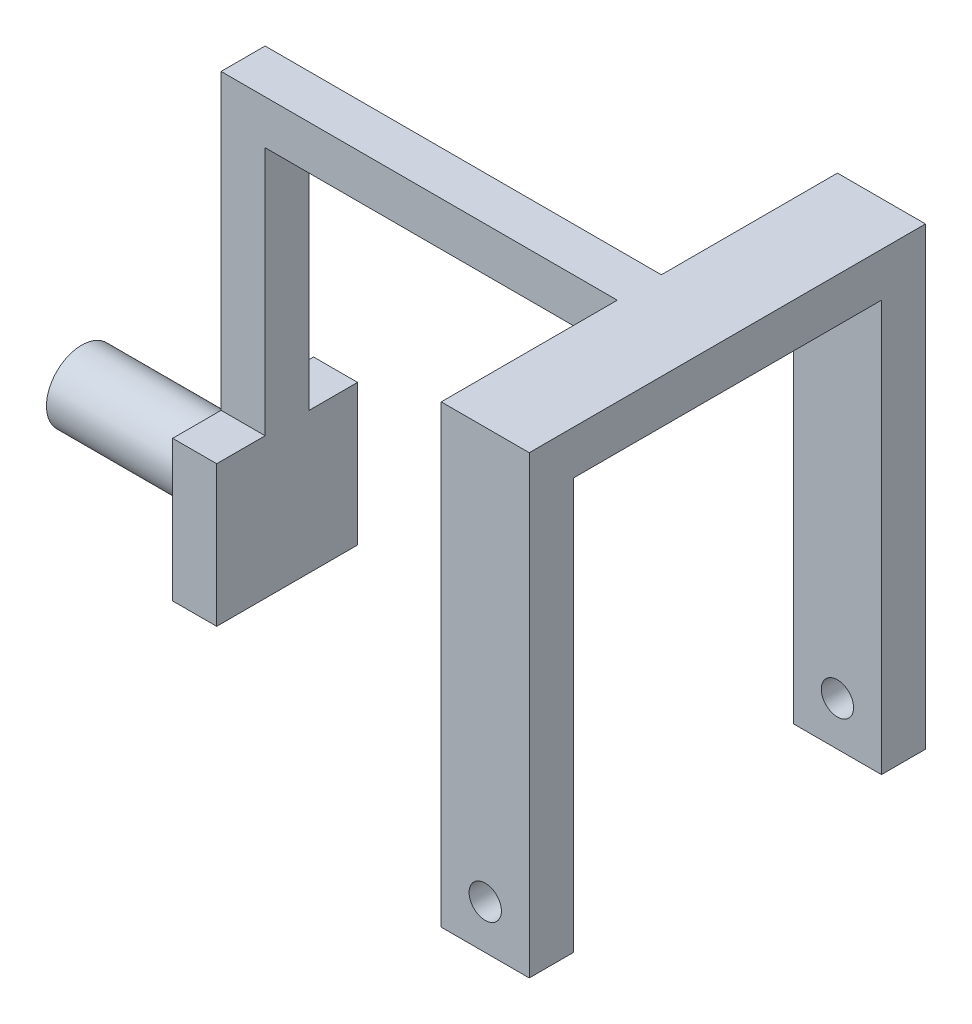
ISO-10303-21;
HEADER;
FILE_DESCRIPTION(('STEP AP214'),'2;1');
FILE_NAME('part.step','',(''),(''),'','','');
FILE_SCHEMA(('AUTOMOTIVE_DESIGN { 1 0 10303 214 1 1 1 1 }'));
ENDSEC;
DATA;
#1=APPLICATION_CONTEXT('core data for automotive mechanical design processes');
#2=APPLICATION_PROTOCOL_DEFINITION('international standard','automotive_design',2000,#1);
#3=PRODUCT_CONTEXT('',#1,'mechanical');
#4=PRODUCT('Part','Part','',(#3));
#5=PRODUCT_RELATED_PRODUCT_CATEGORY('part','',(#4));
#6=PRODUCT_DEFINITION_FORMATION('','',#4);
#7=PRODUCT_DEFINITION_CONTEXT('part definition',#1,'design');
#8=PRODUCT_DEFINITION('design','',#6,#7);
#9=PRODUCT_DEFINITION_SHAPE('','',#8);
#10=(LENGTH_UNIT() NAMED_UNIT(*) SI_UNIT(.MILLI.,.METRE.));
#11=(NAMED_UNIT(*) PLANE_ANGLE_UNIT() SI_UNIT($,.RADIAN.));
#12=(NAMED_UNIT(*) SI_UNIT($,.STERADIAN.) SOLID_ANGLE_UNIT());
#13=UNCERTAINTY_MEASURE_WITH_UNIT(LENGTH_MEASURE(1.E-05),#10,'distance_accuracy_value','');
#14=(GEOMETRIC_REPRESENTATION_CONTEXT(3) GLOBAL_UNCERTAINTY_ASSIGNED_CONTEXT((#13)) GLOBAL_UNIT_ASSIGNED_CONTEXT((#10,
#11,#12)) REPRESENTATION_CONTEXT('',''));
#15=CARTESIAN_POINT('',(0.,0.,0.));
#16=DIRECTION('',(0.,0.,1.));
#17=DIRECTION('',(1.,0.,0.));
#18=AXIS2_PLACEMENT_3D('',#15,#16,#17);
#19=CARTESIAN_POINT('',(220.,109.,7.5));
#20=DIRECTION('',(0.,1.,0.));
#21=DIRECTION('',(0.,0.,1.));
#22=AXIS2_PLACEMENT_3D('',#19,#20,#21);
#23=PLANE('',#22);
#24=DIRECTION('',(-1.,0.,0.));
#25=VECTOR('',#24,1.);
#26=CARTESIAN_POINT('',(190.,109.,-52.5));
#27=LINE('',#26,#25);
#28=CARTESIAN_POINT('',(220.,109.,-52.5));
#29=VERTEX_POINT('',#28);
#30=CARTESIAN_POINT('',(190.,109.,-52.5));
#31=VERTEX_POINT('',#30);
#32=EDGE_CURVE('E197',#29,#31,#27,.T.);
#33=ORIENTED_EDGE('',*,*,#32,.F.);
#34=DIRECTION('',(0.,0.,-1.));
#35=VECTOR('',#34,1.);
#36=CARTESIAN_POINT('',(220.,109.,7.5));
#37=LINE('',#36,#35);
#38=CARTESIAN_POINT('',(220.,109.,52.5));
#39=VERTEX_POINT('',#38);
#40=EDGE_CURVE('E66',#39,#29,#37,.T.);
#41=ORIENTED_EDGE('',*,*,#40,.F.);
#42=DIRECTION('',(1.,0.,0.));
#43=VECTOR('',#42,1.);
#44=CARTESIAN_POINT('',(190.,109.,52.5));
#45=LINE('',#44,#43);
#46=CARTESIAN_POINT('',(190.,109.,52.5));
#47=VERTEX_POINT('',#46);
#48=EDGE_CURVE('E216',#47,#39,#45,.T.);
#49=ORIENTED_EDGE('',*,*,#48,.F.);
#50=DIRECTION('',(0.,0.,-1.));
#51=VECTOR('',#50,1.);
#52=CARTESIAN_POINT('',(190.,109.,67.5));
#53=LINE('',#52,#51);
#54=CARTESIAN_POINT('',(190.,109.,7.50000000000001));
#55=VERTEX_POINT('',#54);
#56=EDGE_CURVE('E239',#47,#55,#53,.T.);
#57=ORIENTED_EDGE('',*,*,#56,.T.);
#58=DIRECTION('',(-1.,0.,0.));
#59=VECTOR('',#58,1.);
#60=CARTESIAN_POINT('',(220.,109.,7.5));
#61=LINE('',#60,#59);
#62=CARTESIAN_POINT('',(70.,109.,7.5));
#63=VERTEX_POINT('',#62);
#64=EDGE_CURVE('E258',#55,#63,#61,.T.);
#65=ORIENTED_EDGE('',*,*,#64,.T.);
#66=DIRECTION('',(0.,0.,-1.));
#67=VECTOR('',#66,1.);
#68=CARTESIAN_POINT('',(70.,109.,7.5));
#69=LINE('',#68,#67);
#70=CARTESIAN_POINT('',(70.,109.,-7.5));
#71=VERTEX_POINT('',#70);
#72=EDGE_CURVE('E250',#63,#71,#69,.T.);
#73=ORIENTED_EDGE('',*,*,#72,.T.);
#74=DIRECTION('',(-1.,0.,0.));
#75=VECTOR('',#74,1.);
#76=CARTESIAN_POINT('',(220.,109.,-7.5));
#77=LINE('',#76,#75);
#78=CARTESIAN_POINT('',(190.,109.,-7.50000000000001));
#79=VERTEX_POINT('',#78);
#80=EDGE_CURVE('E254',#79,#71,#77,.T.);
#81=ORIENTED_EDGE('',*,*,#80,.F.);
#82=EDGE_CURVE('E242',#79,#31,#53,.T.);
#83=ORIENTED_EDGE('',*,*,#82,.T.);
#84=EDGE_LOOP('',(#33,#41,#49,#57,#65,#73,#81,#83));
#85=FACE_BOUND('',#84,.T.);
#86=ADVANCED_FACE('F49',(#85),#23,.F.);
#87=CARTESIAN_POINT('',(70.,0.,0.));
#88=DIRECTION('',(-1.,0.,0.));
#89=DIRECTION('',(0.,0.,1.));
#90=AXIS2_PLACEMENT_3D('',#87,#88,#89);
#91=PLANE('',#90);
#92=ORIENTED_EDGE('',*,*,#72,.F.);
#93=DIRECTION('',(0.,-1.,0.));
#94=VECTOR('',#93,1.);
#95=CARTESIAN_POINT('',(70.,124.,7.5));
#96=LINE('',#95,#94);
#97=CARTESIAN_POINT('',(70.,24.,7.5));
#98=VERTEX_POINT('',#97);
#99=EDGE_CURVE('E269',#63,#98,#96,.T.);
#100=ORIENTED_EDGE('',*,*,#99,.T.);
#101=DIRECTION('',(0.,0.,1.));
#102=VECTOR('',#101,1.);
#103=CARTESIAN_POINT('',(70.,24.,24.));
#104=LINE('',#103,#102);
#105=CARTESIAN_POINT('',(70.,24.,24.));
#106=VERTEX_POINT('',#105);
#107=EDGE_CURVE('E287',#98,#106,#104,.T.);
#108=ORIENTED_EDGE('',*,*,#107,.T.);
#109=DIRECTION('',(0.,-1.,0.));
#110=VECTOR('',#109,1.);
#111=CARTESIAN_POINT('',(70.,-24.,24.));
#112=LINE('',#111,#110);
#113=CARTESIAN_POINT('',(70.,-24.,24.));
#114=VERTEX_POINT('',#113);
#115=EDGE_CURVE('E292',#106,#114,#112,.T.);
#116=ORIENTED_EDGE('',*,*,#115,.T.);
#117=DIRECTION('',(0.,0.,-1.));
#118=VECTOR('',#117,1.);
#119=CARTESIAN_POINT('',(70.,-24.,24.));
#120=LINE('',#119,#118);
#121=CARTESIAN_POINT('',(70.,-24.,-24.));
#122=VERTEX_POINT('',#121);
#123=EDGE_CURVE('E294',#114,#122,#120,.T.);
#124=ORIENTED_EDGE('',*,*,#123,.T.);
#125=DIRECTION('',(0.,1.,0.));
#126=VECTOR('',#125,1.);
#127=CARTESIAN_POINT('',(70.,-24.,-24.));
#128=LINE('',#127,#126);
#129=CARTESIAN_POINT('',(70.,24.,-24.));
#130=VERTEX_POINT('',#129);
#131=EDGE_CURVE('E284',#122,#130,#128,.T.);
#132=ORIENTED_EDGE('',*,*,#131,.T.);
#133=CARTESIAN_POINT('',(70.,24.,-7.5));
#134=VERTEX_POINT('',#133);
#135=EDGE_CURVE('E289',#130,#134,#104,.T.);
#136=ORIENTED_EDGE('',*,*,#135,.T.);
#137=DIRECTION('',(0.,-1.,0.));
#138=VECTOR('',#137,1.);
#139=CARTESIAN_POINT('',(70.,124.,-7.5));
#140=LINE('',#139,#138);
#141=EDGE_CURVE('E281',#71,#134,#140,.T.);
#142=ORIENTED_EDGE('',*,*,#141,.F.);
#143=EDGE_LOOP('',(#92,#100,#108,#116,#124,#132,#136,#142));
#144=FACE_BOUND('',#143,.T.);
#145=ADVANCED_FACE('F332',(#144),#91,.F.);
#146=CARTESIAN_POINT('',(70.,24.,24.));
#147=DIRECTION('',(0.,-1.,0.));
#148=DIRECTION('',(0.,0.,-1.));
#149=AXIS2_PLACEMENT_3D('',#146,#147,#148);
#150=PLANE('',#149);
#151=DIRECTION('',(1.,0.,0.));
#152=VECTOR('',#151,1.);
#153=CARTESIAN_POINT('',(55.,24.,7.5));
#154=LINE('',#153,#152);
#155=CARTESIAN_POINT('',(55.,24.,7.5));
#156=VERTEX_POINT('',#155);
#157=EDGE_CURVE('E264',#156,#98,#154,.T.);
#158=ORIENTED_EDGE('',*,*,#157,.F.);
#159=DIRECTION('',(0.,0.,1.));
#160=VECTOR('',#159,1.);
#161=CARTESIAN_POINT('',(55.,24.,24.));
#162=LINE('',#161,#160);
#163=CARTESIAN_POINT('',(55.,24.,24.));
#164=VERTEX_POINT('',#163);
#165=EDGE_CURVE('E299',#156,#164,#162,.T.);
#166=ORIENTED_EDGE('',*,*,#165,.T.);
#167=DIRECTION('',(-1.,0.,0.));
#168=VECTOR('',#167,1.);
#169=CARTESIAN_POINT('',(70.,24.,24.));
#170=LINE('',#169,#168);
#171=EDGE_CURVE('E310',#106,#164,#170,.T.);
#172=ORIENTED_EDGE('',*,*,#171,.F.);
#173=ORIENTED_EDGE('',*,*,#107,.F.);
#174=EDGE_LOOP('',(#158,#166,#172,#173));
#175=FACE_BOUND('',#174,.T.);
#176=ADVANCED_FACE('F337',(#175),#150,.F.);
#177=DIRECTION('',(-1.,0.,0.));
#178=VECTOR('',#177,1.);
#179=CARTESIAN_POINT('',(55.,24.,-7.5));
#180=LINE('',#179,#178);
#181=CARTESIAN_POINT('',(55.,24.,-7.5));
#182=VERTEX_POINT('',#181);
#183=EDGE_CURVE('E260',#134,#182,#180,.T.);
#184=ORIENTED_EDGE('',*,*,#183,.F.);
#185=ORIENTED_EDGE('',*,*,#135,.F.);
#186=DIRECTION('',(-1.,0.,0.));
#187=VECTOR('',#186,1.);
#188=CARTESIAN_POINT('',(70.,24.,-24.));
#189=LINE('',#188,#187);
#190=CARTESIAN_POINT('',(55.,24.,-24.));
#191=VERTEX_POINT('',#190);
#192=EDGE_CURVE('E313',#130,#191,#189,.T.);
#193=ORIENTED_EDGE('',*,*,#192,.T.);
#194=EDGE_CURVE('E300',#191,#182,#162,.T.);
#195=ORIENTED_EDGE('',*,*,#194,.T.);
#196=EDGE_LOOP('',(#184,#185,#193,#195));
#197=FACE_BOUND('',#196,.T.);
#198=ADVANCED_FACE('F329',(#197),#150,.F.);
#199=CARTESIAN_POINT('',(55.,0.,0.));
#200=DIRECTION('',(-1.,0.,0.));
#201=DIRECTION('',(0.,0.,1.));
#202=AXIS2_PLACEMENT_3D('',#199,#200,#201);
#203=CYLINDRICAL_SURFACE('',#202,12.);
#204=CARTESIAN_POINT('',(55.,0.,0.));
#205=DIRECTION('',(1.,0.,0.));
#206=DIRECTION('',(0.,0.,-1.));
#207=AXIS2_PLACEMENT_3D('',#204,#205,#206);
#208=CIRCLE('',#207,12.);
#209=CARTESIAN_POINT('',(55.,0.,-12.));
#210=VERTEX_POINT('',#209);
#211=EDGE_CURVE('E11',#210,#210,#208,.T.);
#212=ORIENTED_EDGE('',*,*,#211,.F.);
#213=EDGE_LOOP('',(#212));
#214=FACE_BOUND('',#213,.T.);
#215=CARTESIAN_POINT('',(0.,0.,0.));
#216=DIRECTION('',(1.,0.,0.));
#217=DIRECTION('',(0.,0.,-1.));
#218=AXIS2_PLACEMENT_3D('',#215,#216,#217);
#219=CIRCLE('',#218,12.);
#220=CARTESIAN_POINT('',(0.,0.,-12.));
#221=VERTEX_POINT('',#220);
#222=EDGE_CURVE('E58',#221,#221,#219,.T.);
#223=ORIENTED_EDGE('',*,*,#222,.T.);
#224=EDGE_LOOP('',(#223));
#225=FACE_BOUND('',#224,.T.);
#226=ADVANCED_FACE('F51',(#214,#225),#203,.T.);
#227=CARTESIAN_POINT('',(0.,0.,0.));
#228=DIRECTION('',(1.,0.,0.));
#229=DIRECTION('',(0.,0.,-1.));
#230=AXIS2_PLACEMENT_3D('',#227,#228,#229);
#231=PLANE('',#230);
#232=ORIENTED_EDGE('',*,*,#222,.F.);
#233=EDGE_LOOP('',(#232));
#234=FACE_BOUND('',#233,.T.);
#235=ADVANCED_FACE('F319',(#234),#231,.F.);
#236=CARTESIAN_POINT('',(70.,-24.,-24.));
#237=DIRECTION('',(0.,0.,1.));
#238=DIRECTION('',(1.,0.,0.));
#239=AXIS2_PLACEMENT_3D('',#236,#237,#238);
#240=PLANE('',#239);
#241=DIRECTION('',(0.,1.,0.));
#242=VECTOR('',#241,1.);
#243=CARTESIAN_POINT('',(55.,-24.,-24.));
#244=LINE('',#243,#242);
#245=CARTESIAN_POINT('',(55.,-24.,-24.));
#246=VERTEX_POINT('',#245);
#247=EDGE_CURVE('E283',#246,#191,#244,.T.);
#248=ORIENTED_EDGE('',*,*,#247,.T.);
#249=ORIENTED_EDGE('',*,*,#192,.F.);
#250=ORIENTED_EDGE('',*,*,#131,.F.);
#251=DIRECTION('',(-1.,0.,0.));
#252=VECTOR('',#251,1.);
#253=CARTESIAN_POINT('',(70.,-24.,-24.));
#254=LINE('',#253,#252);
#255=EDGE_CURVE('E296',#122,#246,#254,.T.);
#256=ORIENTED_EDGE('',*,*,#255,.T.);
#257=EDGE_LOOP('',(#248,#249,#250,#256));
#258=FACE_BOUND('',#257,.T.);
#259=ADVANCED_FACE('F321',(#258),#240,.F.);
#260=CARTESIAN_POINT('',(70.,-24.,24.));
#261=DIRECTION('',(0.,0.,-1.));
#262=DIRECTION('',(-1.,0.,0.));
#263=AXIS2_PLACEMENT_3D('',#260,#261,#262);
#264=PLANE('',#263);
#265=DIRECTION('',(0.,-1.,0.));
#266=VECTOR('',#265,1.);
#267=CARTESIAN_POINT('',(55.,-24.,24.));
#268=LINE('',#267,#266);
#269=CARTESIAN_POINT('',(55.,-24.,24.));
#270=VERTEX_POINT('',#269);
#271=EDGE_CURVE('E302',#164,#270,#268,.T.);
#272=ORIENTED_EDGE('',*,*,#271,.T.);
#273=DIRECTION('',(-1.,0.,0.));
#274=VECTOR('',#273,1.);
#275=CARTESIAN_POINT('',(70.,-24.,24.));
#276=LINE('',#275,#274);
#277=EDGE_CURVE('E307',#114,#270,#276,.T.);
#278=ORIENTED_EDGE('',*,*,#277,.F.);
#279=ORIENTED_EDGE('',*,*,#115,.F.);
#280=ORIENTED_EDGE('',*,*,#171,.T.);
#281=EDGE_LOOP('',(#272,#278,#279,#280));
#282=FACE_BOUND('',#281,.T.);
#283=ADVANCED_FACE('F326',(#282),#264,.F.);
#284=CARTESIAN_POINT('',(70.,-24.,24.));
#285=DIRECTION('',(0.,1.,0.));
#286=DIRECTION('',(0.,0.,1.));
#287=AXIS2_PLACEMENT_3D('',#284,#285,#286);
#288=PLANE('',#287);
#289=DIRECTION('',(0.,0.,-1.));
#290=VECTOR('',#289,1.);
#291=CARTESIAN_POINT('',(55.,-24.,24.));
#292=LINE('',#291,#290);
#293=EDGE_CURVE('E288',#270,#246,#292,.T.);
#294=ORIENTED_EDGE('',*,*,#293,.T.);
#295=ORIENTED_EDGE('',*,*,#255,.F.);
#296=ORIENTED_EDGE('',*,*,#123,.F.);
#297=ORIENTED_EDGE('',*,*,#277,.T.);
#298=EDGE_LOOP('',(#294,#295,#296,#297));
#299=FACE_BOUND('',#298,.T.);
#300=ADVANCED_FACE('F357',(#299),#288,.F.);
#301=CARTESIAN_POINT('',(55.,0.,0.));
#302=DIRECTION('',(-1.,0.,0.));
#303=DIRECTION('',(0.,0.,1.));
#304=AXIS2_PLACEMENT_3D('',#301,#302,#303);
#305=PLANE('',#304);
#306=ORIENTED_EDGE('',*,*,#211,.T.);
#307=EDGE_LOOP('',(#306));
#308=FACE_BOUND('',#307,.T.);
#309=ORIENTED_EDGE('',*,*,#247,.F.);
#310=ORIENTED_EDGE('',*,*,#293,.F.);
#311=ORIENTED_EDGE('',*,*,#271,.F.);
#312=ORIENTED_EDGE('',*,*,#165,.F.);
#313=DIRECTION('',(0.,-1.,0.));
#314=VECTOR('',#313,1.);
#315=CARTESIAN_POINT('',(55.,124.,7.5));
#316=LINE('',#315,#314);
#317=CARTESIAN_POINT('',(55.,124.,7.5));
#318=VERTEX_POINT('',#317);
#319=EDGE_CURVE('E275',#318,#156,#316,.T.);
#320=ORIENTED_EDGE('',*,*,#319,.F.);
#321=DIRECTION('',(0.,0.,1.));
#322=VECTOR('',#321,1.);
#323=CARTESIAN_POINT('',(55.,124.,7.5));
#324=LINE('',#323,#322);
#325=CARTESIAN_POINT('',(55.,124.,-7.5));
#326=VERTEX_POINT('',#325);
#327=EDGE_CURVE('E263',#326,#318,#324,.T.);
#328=ORIENTED_EDGE('',*,*,#327,.F.);
#329=DIRECTION('',(0.,-1.,0.));
#330=VECTOR('',#329,1.);
#331=CARTESIAN_POINT('',(55.,124.,-7.5));
#332=LINE('',#331,#330);
#333=EDGE_CURVE('E278',#326,#182,#332,.T.);
#334=ORIENTED_EDGE('',*,*,#333,.T.);
#335=ORIENTED_EDGE('',*,*,#194,.F.);
#336=EDGE_LOOP('',(#309,#310,#311,#312,#320,#328,#334,#335));
#337=FACE_BOUND('',#336,.T.);
#338=ADVANCED_FACE('F352',(#308,#337),#305,.T.);
#339=CARTESIAN_POINT('',(55.,124.,-7.5));
#340=DIRECTION('',(0.,0.,1.));
#341=DIRECTION('',(1.,0.,0.));
#342=AXIS2_PLACEMENT_3D('',#339,#340,#341);
#343=PLANE('',#342);
#344=DIRECTION('',(-1.,0.,0.));
#345=VECTOR('',#344,1.);
#346=CARTESIAN_POINT('',(55.,124.,-7.5));
#347=LINE('',#346,#345);
#348=CARTESIAN_POINT('',(190.,124.,-7.5));
#349=VERTEX_POINT('',#348);
#350=EDGE_CURVE('E261',#349,#326,#347,.T.);
#351=ORIENTED_EDGE('',*,*,#350,.F.);
#352=DIRECTION('',(0.,-1.,0.));
#353=VECTOR('',#352,1.);
#354=CARTESIAN_POINT('',(190.,124.,-7.5));
#355=LINE('',#354,#353);
#356=EDGE_CURVE('E247',#349,#79,#355,.T.);
#357=ORIENTED_EDGE('',*,*,#356,.T.);
#358=ORIENTED_EDGE('',*,*,#80,.T.);
#359=ORIENTED_EDGE('',*,*,#141,.T.);
#360=ORIENTED_EDGE('',*,*,#183,.T.);
#361=ORIENTED_EDGE('',*,*,#333,.F.);
#362=EDGE_LOOP('',(#351,#357,#358,#359,#360,#361));
#363=FACE_BOUND('',#362,.T.);
#364=ADVANCED_FACE('F349',(#363),#343,.F.);
#365=CARTESIAN_POINT('',(55.,124.,7.5));
#366=DIRECTION('',(0.,0.,-1.));
#367=DIRECTION('',(-1.,0.,0.));
#368=AXIS2_PLACEMENT_3D('',#365,#366,#367);
#369=PLANE('',#368);
#370=ORIENTED_EDGE('',*,*,#64,.F.);
#371=DIRECTION('',(0.,1.,0.));
#372=VECTOR('',#371,1.);
#373=CARTESIAN_POINT('',(190.,124.,7.5));
#374=LINE('',#373,#372);
#375=CARTESIAN_POINT('',(190.,124.,7.50000000000001));
#376=VERTEX_POINT('',#375);
#377=EDGE_CURVE('E241',#55,#376,#374,.T.);
#378=ORIENTED_EDGE('',*,*,#377,.T.);
#379=DIRECTION('',(1.,0.,0.));
#380=VECTOR('',#379,1.);
#381=CARTESIAN_POINT('',(55.,124.,7.5));
#382=LINE('',#381,#380);
#383=EDGE_CURVE('E266',#318,#376,#382,.T.);
#384=ORIENTED_EDGE('',*,*,#383,.F.);
#385=ORIENTED_EDGE('',*,*,#319,.T.);
#386=ORIENTED_EDGE('',*,*,#157,.T.);
#387=ORIENTED_EDGE('',*,*,#99,.F.);
#388=EDGE_LOOP('',(#370,#378,#384,#385,#386,#387));
#389=FACE_BOUND('',#388,.T.);
#390=ADVANCED_FACE('F346',(#389),#369,.F.);
#391=CARTESIAN_POINT('',(0.,124.,0.));
#392=DIRECTION('',(0.,-1.,0.));
#393=DIRECTION('',(0.,0.,-1.));
#394=AXIS2_PLACEMENT_3D('',#391,#392,#393);
#395=PLANE('',#394);
#396=ORIENTED_EDGE('',*,*,#383,.T.);
#397=DIRECTION('',(0.,0.,-1.));
#398=VECTOR('',#397,1.);
#399=CARTESIAN_POINT('',(190.,124.,67.5));
#400=LINE('',#399,#398);
#401=CARTESIAN_POINT('',(190.,124.,67.5));
#402=VERTEX_POINT('',#401);
#403=EDGE_CURVE('E243',#402,#376,#400,.T.);
#404=ORIENTED_EDGE('',*,*,#403,.F.);
#405=DIRECTION('',(1.,0.,0.));
#406=VECTOR('',#405,1.);
#407=CARTESIAN_POINT('',(220.,124.,67.5));
#408=LINE('',#407,#406);
#409=CARTESIAN_POINT('',(220.,124.,67.5));
#410=VERTEX_POINT('',#409);
#411=EDGE_CURVE('E234',#402,#410,#408,.T.);
#412=ORIENTED_EDGE('',*,*,#411,.T.);
#413=DIRECTION('',(0.,0.,1.));
#414=VECTOR('',#413,1.);
#415=CARTESIAN_POINT('',(220.,124.,7.5));
#416=LINE('',#415,#414);
#417=CARTESIAN_POINT('',(220.,124.,-67.5));
#418=VERTEX_POINT('',#417);
#419=EDGE_CURVE('E251',#418,#410,#416,.T.);
#420=ORIENTED_EDGE('',*,*,#419,.F.);
#421=DIRECTION('',(1.,0.,0.));
#422=VECTOR('',#421,1.);
#423=CARTESIAN_POINT('',(220.,124.,-67.5));
#424=LINE('',#423,#422);
#425=CARTESIAN_POINT('',(190.,124.,-67.5));
#426=VERTEX_POINT('',#425);
#427=EDGE_CURVE('E204',#426,#418,#424,.T.);
#428=ORIENTED_EDGE('',*,*,#427,.F.);
#429=EDGE_CURVE('E74',#349,#426,#400,.T.);
#430=ORIENTED_EDGE('',*,*,#429,.F.);
#431=ORIENTED_EDGE('',*,*,#350,.T.);
#432=ORIENTED_EDGE('',*,*,#327,.T.);
#433=EDGE_LOOP('',(#396,#404,#412,#420,#428,#430,#431,#432));
#434=FACE_BOUND('',#433,.T.);
#435=ADVANCED_FACE('F343',(#434),#395,.F.);
#436=CARTESIAN_POINT('',(220.,0.,0.));
#437=DIRECTION('',(-1.,0.,0.));
#438=DIRECTION('',(0.,0.,1.));
#439=AXIS2_PLACEMENT_3D('',#436,#437,#438);
#440=PLANE('',#439);
#441=DIRECTION('',(0.,-1.,0.));
#442=VECTOR('',#441,1.);
#443=CARTESIAN_POINT('',(220.,109.,67.5));
#444=LINE('',#443,#442);
#445=CARTESIAN_POINT('',(220.,-31.,67.5));
#446=VERTEX_POINT('',#445);
#447=EDGE_CURVE('E237',#410,#446,#444,.T.);
#448=ORIENTED_EDGE('',*,*,#447,.T.);
#449=DIRECTION('',(0.,0.,1.));
#450=VECTOR('',#449,1.);
#451=CARTESIAN_POINT('',(220.,-31.,52.5));
#452=LINE('',#451,#450);
#453=CARTESIAN_POINT('',(220.,-31.,52.5));
#454=VERTEX_POINT('',#453);
#455=EDGE_CURVE('E218',#454,#446,#452,.T.);
#456=ORIENTED_EDGE('',*,*,#455,.F.);
#457=DIRECTION('',(0.,1.,0.));
#458=VECTOR('',#457,1.);
#459=CARTESIAN_POINT('',(220.,-31.,52.5));
#460=LINE('',#459,#458);
#461=EDGE_CURVE('E212',#454,#39,#460,.T.);
#462=ORIENTED_EDGE('',*,*,#461,.T.);
#463=ORIENTED_EDGE('',*,*,#40,.T.);
#464=DIRECTION('',(0.,1.,0.));
#465=VECTOR('',#464,1.);
#466=CARTESIAN_POINT('',(220.,-31.,-52.5));
#467=LINE('',#466,#465);
#468=CARTESIAN_POINT('',(220.,-31.,-52.5));
#469=VERTEX_POINT('',#468);
#470=EDGE_CURVE('E181',#469,#29,#467,.T.);
#471=ORIENTED_EDGE('',*,*,#470,.F.);
#472=DIRECTION('',(0.,0.,1.));
#473=VECTOR('',#472,1.);
#474=CARTESIAN_POINT('',(220.,-31.,-67.5));
#475=LINE('',#474,#473);
#476=CARTESIAN_POINT('',(220.,-31.,-67.5));
#477=VERTEX_POINT('',#476);
#478=EDGE_CURVE('E188',#477,#469,#475,.T.);
#479=ORIENTED_EDGE('',*,*,#478,.F.);
#480=DIRECTION('',(0.,-1.,0.));
#481=VECTOR('',#480,1.);
#482=CARTESIAN_POINT('',(220.,109.,-67.5));
#483=LINE('',#482,#481);
#484=EDGE_CURVE('E229',#418,#477,#483,.T.);
#485=ORIENTED_EDGE('',*,*,#484,.F.);
#486=ORIENTED_EDGE('',*,*,#419,.T.);
#487=EDGE_LOOP('',(#448,#456,#462,#463,#471,#479,#485,#486));
#488=FACE_BOUND('',#487,.T.);
#489=ADVANCED_FACE('F199',(#488),#440,.F.);
#490=CARTESIAN_POINT('',(0.,0.,67.5));
#491=DIRECTION('',(0.,0.,1.));
#492=DIRECTION('',(1.,0.,0.));
#493=AXIS2_PLACEMENT_3D('',#490,#491,#492);
#494=PLANE('',#493);
#495=CARTESIAN_POINT('',(205.,-16.,67.5));
#496=DIRECTION('',(0.,0.,1.));
#497=DIRECTION('',(1.,0.,0.));
#498=AXIS2_PLACEMENT_3D('',#495,#496,#497);
#499=CIRCLE('',#498,5.50000000000002);
#500=CARTESIAN_POINT('',(210.5,-16.,67.5));
#501=VERTEX_POINT('',#500);
#502=EDGE_CURVE('E422',#501,#501,#499,.T.);
#503=ORIENTED_EDGE('',*,*,#502,.F.);
#504=EDGE_LOOP('',(#503));
#505=FACE_BOUND('',#504,.T.);
#506=DIRECTION('',(0.,1.,0.));
#507=VECTOR('',#506,1.);
#508=CARTESIAN_POINT('',(190.,109.,67.5));
#509=LINE('',#508,#507);
#510=CARTESIAN_POINT('',(190.,-31.,67.5));
#511=VERTEX_POINT('',#510);
#512=EDGE_CURVE('E231',#511,#402,#509,.T.);
#513=ORIENTED_EDGE('',*,*,#512,.F.);
#514=DIRECTION('',(-1.,0.,0.));
#515=VECTOR('',#514,1.);
#516=CARTESIAN_POINT('',(190.,-31.,67.5));
#517=LINE('',#516,#515);
#518=EDGE_CURVE('E222',#446,#511,#517,.T.);
#519=ORIENTED_EDGE('',*,*,#518,.F.);
#520=ORIENTED_EDGE('',*,*,#447,.F.);
#521=ORIENTED_EDGE('',*,*,#411,.F.);
#522=EDGE_LOOP('',(#513,#519,#520,#521));
#523=FACE_BOUND('',#522,.T.);
#524=ADVANCED_FACE('F405',(#505,#523),#494,.T.);
#525=CARTESIAN_POINT('',(190.,109.,67.5));
#526=DIRECTION('',(-1.,0.,0.));
#527=DIRECTION('',(0.,0.,1.));
#528=AXIS2_PLACEMENT_3D('',#525,#526,#527);
#529=PLANE('',#528);
#530=ORIENTED_EDGE('',*,*,#377,.F.);
#531=ORIENTED_EDGE('',*,*,#56,.F.);
#532=DIRECTION('',(0.,1.,0.));
#533=VECTOR('',#532,1.);
#534=CARTESIAN_POINT('',(190.,-31.,52.5));
#535=LINE('',#534,#533);
#536=CARTESIAN_POINT('',(190.,-31.,52.5));
#537=VERTEX_POINT('',#536);
#538=EDGE_CURVE('E209',#537,#47,#535,.T.);
#539=ORIENTED_EDGE('',*,*,#538,.F.);
#540=DIRECTION('',(0.,0.,-1.));
#541=VECTOR('',#540,1.);
#542=CARTESIAN_POINT('',(190.,-31.,52.5));
#543=LINE('',#542,#541);
#544=EDGE_CURVE('E220',#511,#537,#543,.T.);
#545=ORIENTED_EDGE('',*,*,#544,.F.);
#546=ORIENTED_EDGE('',*,*,#512,.T.);
#547=ORIENTED_EDGE('',*,*,#403,.T.);
#548=EDGE_LOOP('',(#530,#531,#539,#545,#546,#547));
#549=FACE_BOUND('',#548,.T.);
#550=ADVANCED_FACE('F401',(#549),#529,.T.);
#551=ORIENTED_EDGE('',*,*,#356,.F.);
#552=ORIENTED_EDGE('',*,*,#429,.T.);
#553=DIRECTION('',(0.,1.,0.));
#554=VECTOR('',#553,1.);
#555=CARTESIAN_POINT('',(190.,109.,-67.5));
#556=LINE('',#555,#554);
#557=CARTESIAN_POINT('',(190.,-31.,-67.5));
#558=VERTEX_POINT('',#557);
#559=EDGE_CURVE('E201',#558,#426,#556,.T.);
#560=ORIENTED_EDGE('',*,*,#559,.F.);
#561=DIRECTION('',(0.,0.,-1.));
#562=VECTOR('',#561,1.);
#563=CARTESIAN_POINT('',(190.,-31.,-67.5));
#564=LINE('',#563,#562);
#565=CARTESIAN_POINT('',(190.,-31.,-52.5));
#566=VERTEX_POINT('',#565);
#567=EDGE_CURVE('E187',#566,#558,#564,.T.);
#568=ORIENTED_EDGE('',*,*,#567,.F.);
#569=DIRECTION('',(0.,1.,0.));
#570=VECTOR('',#569,1.);
#571=CARTESIAN_POINT('',(190.,-31.,-52.5));
#572=LINE('',#571,#570);
#573=EDGE_CURVE('E183',#566,#31,#572,.T.);
#574=ORIENTED_EDGE('',*,*,#573,.T.);
#575=ORIENTED_EDGE('',*,*,#82,.F.);
#576=EDGE_LOOP('',(#551,#552,#560,#568,#574,#575));
#577=FACE_BOUND('',#576,.T.);
#578=ADVANCED_FACE('F415',(#577),#529,.T.);
#579=CARTESIAN_POINT('',(0.,0.,-67.5));
#580=DIRECTION('',(0.,0.,1.));
#581=DIRECTION('',(1.,0.,0.));
#582=AXIS2_PLACEMENT_3D('',#579,#580,#581);
#583=PLANE('',#582);
#584=CARTESIAN_POINT('',(205.,-16.,-67.5));
#585=DIRECTION('',(0.,0.,1.));
#586=DIRECTION('',(1.,0.,0.));
#587=AXIS2_PLACEMENT_3D('',#584,#585,#586);
#588=CIRCLE('',#587,5.50000000000002);
#589=CARTESIAN_POINT('',(210.5,-16.,-67.5));
#590=VERTEX_POINT('',#589);
#591=EDGE_CURVE('E425',#590,#590,#588,.T.);
#592=ORIENTED_EDGE('',*,*,#591,.T.);
#593=EDGE_LOOP('',(#592));
#594=FACE_BOUND('',#593,.T.);
#595=ORIENTED_EDGE('',*,*,#559,.T.);
#596=ORIENTED_EDGE('',*,*,#427,.T.);
#597=ORIENTED_EDGE('',*,*,#484,.T.);
#598=DIRECTION('',(1.,0.,0.));
#599=VECTOR('',#598,1.);
#600=CARTESIAN_POINT('',(190.,-31.,-67.5));
#601=LINE('',#600,#599);
#602=EDGE_CURVE('E194',#558,#477,#601,.T.);
#603=ORIENTED_EDGE('',*,*,#602,.F.);
#604=EDGE_LOOP('',(#595,#596,#597,#603));
#605=FACE_BOUND('',#604,.T.);
#606=ADVANCED_FACE('F413',(#594,#605),#583,.F.);
#607=CARTESIAN_POINT('',(190.,-31.,-52.5));
#608=DIRECTION('',(0.,0.,-1.));
#609=DIRECTION('',(-1.,0.,0.));
#610=AXIS2_PLACEMENT_3D('',#607,#608,#609);
#611=PLANE('',#610);
#612=CARTESIAN_POINT('',(205.,-16.,-52.5));
#613=DIRECTION('',(0.,0.,-1.));
#614=DIRECTION('',(-1.,0.,0.));
#615=AXIS2_PLACEMENT_3D('',#612,#613,#614);
#616=CIRCLE('',#615,5.50000000000002);
#617=CARTESIAN_POINT('',(199.5,-16.,-52.5));
#618=VERTEX_POINT('',#617);
#619=EDGE_CURVE('E213',#618,#618,#616,.T.);
#620=ORIENTED_EDGE('',*,*,#619,.T.);
#621=EDGE_LOOP('',(#620));
#622=FACE_BOUND('',#621,.T.);
#623=ORIENTED_EDGE('',*,*,#32,.T.);
#624=ORIENTED_EDGE('',*,*,#573,.F.);
#625=DIRECTION('',(-1.,0.,0.));
#626=VECTOR('',#625,1.);
#627=CARTESIAN_POINT('',(190.,-31.,-52.5));
#628=LINE('',#627,#626);
#629=EDGE_CURVE('E177',#469,#566,#628,.T.);
#630=ORIENTED_EDGE('',*,*,#629,.F.);
#631=ORIENTED_EDGE('',*,*,#470,.T.);
#632=EDGE_LOOP('',(#623,#624,#630,#631));
#633=FACE_BOUND('',#632,.T.);
#634=ADVANCED_FACE('F179',(#622,#633),#611,.F.);
#635=CARTESIAN_POINT('',(0.,-31.,0.));
#636=DIRECTION('',(0.,1.,0.));
#637=DIRECTION('',(0.,0.,1.));
#638=AXIS2_PLACEMENT_3D('',#635,#636,#637);
#639=PLANE('',#638);
#640=ORIENTED_EDGE('',*,*,#478,.T.);
#641=ORIENTED_EDGE('',*,*,#629,.T.);
#642=ORIENTED_EDGE('',*,*,#567,.T.);
#643=ORIENTED_EDGE('',*,*,#602,.T.);
#644=EDGE_LOOP('',(#640,#641,#642,#643));
#645=FACE_BOUND('',#644,.T.);
#646=ADVANCED_FACE('F192',(#645),#639,.F.);
#647=CARTESIAN_POINT('',(190.,-31.,52.5));
#648=DIRECTION('',(0.,0.,1.));
#649=DIRECTION('',(1.,0.,0.));
#650=AXIS2_PLACEMENT_3D('',#647,#648,#649);
#651=PLANE('',#650);
#652=CARTESIAN_POINT('',(205.,-16.,52.5));
#653=DIRECTION('',(0.,0.,1.));
#654=DIRECTION('',(1.,0.,0.));
#655=AXIS2_PLACEMENT_3D('',#652,#653,#654);
#656=CIRCLE('',#655,5.50000000000002);
#657=CARTESIAN_POINT('',(210.5,-16.,52.5));
#658=VERTEX_POINT('',#657);
#659=EDGE_CURVE('E53',#658,#658,#656,.T.);
#660=ORIENTED_EDGE('',*,*,#659,.T.);
#661=EDGE_LOOP('',(#660));
#662=FACE_BOUND('',#661,.T.);
#663=ORIENTED_EDGE('',*,*,#48,.T.);
#664=ORIENTED_EDGE('',*,*,#461,.F.);
#665=DIRECTION('',(1.,0.,0.));
#666=VECTOR('',#665,1.);
#667=CARTESIAN_POINT('',(190.,-31.,52.5));
#668=LINE('',#667,#666);
#669=EDGE_CURVE('E215',#537,#454,#668,.T.);
#670=ORIENTED_EDGE('',*,*,#669,.F.);
#671=ORIENTED_EDGE('',*,*,#538,.T.);
#672=EDGE_LOOP('',(#663,#664,#670,#671));
#673=FACE_BOUND('',#672,.T.);
#674=ADVANCED_FACE('F432',(#662,#673),#651,.F.);
#675=CARTESIAN_POINT('',(0.,-31.,0.));
#676=DIRECTION('',(0.,1.,0.));
#677=DIRECTION('',(0.,0.,1.));
#678=AXIS2_PLACEMENT_3D('',#675,#676,#677);
#679=PLANE('',#678);
#680=ORIENTED_EDGE('',*,*,#455,.T.);
#681=ORIENTED_EDGE('',*,*,#518,.T.);
#682=ORIENTED_EDGE('',*,*,#544,.T.);
#683=ORIENTED_EDGE('',*,*,#669,.T.);
#684=EDGE_LOOP('',(#680,#681,#682,#683));
#685=FACE_BOUND('',#684,.T.);
#686=ADVANCED_FACE('F408',(#685),#679,.F.);
#687=CARTESIAN_POINT('',(205.,-16.,-67.5));
#688=DIRECTION('',(0.,0.,1.));
#689=DIRECTION('',(1.,0.,0.));
#690=AXIS2_PLACEMENT_3D('',#687,#688,#689);
#691=CYLINDRICAL_SURFACE('',#690,5.50000000000002);
#692=ORIENTED_EDGE('',*,*,#502,.T.);
#693=EDGE_LOOP('',(#692));
#694=FACE_BOUND('',#693,.T.);
#695=ORIENTED_EDGE('',*,*,#659,.F.);
#696=EDGE_LOOP('',(#695));
#697=FACE_BOUND('',#696,.T.);
#698=ADVANCED_FACE('F435',(#694,#697),#691,.F.);
#699=ORIENTED_EDGE('',*,*,#591,.F.);
#700=EDGE_LOOP('',(#699));
#701=FACE_BOUND('',#700,.T.);
#702=ORIENTED_EDGE('',*,*,#619,.F.);
#703=EDGE_LOOP('',(#702));
#704=FACE_BOUND('',#703,.T.);
#705=ADVANCED_FACE('F437',(#701,#704),#691,.F.);
#706=CLOSED_SHELL('',(#86,#145,#176,#198,#226,#235,#259,#283,#300,#338,#364,#390,#435,#489,#524,
#550,#578,#606,#634,#646,#674,#686,#698,#705));
#707=MANIFOLD_SOLID_BREP('B2',#706);
#708=ADVANCED_BREP_SHAPE_REPRESENTATION('',(#18,#707),#14);
#709=SHAPE_DEFINITION_REPRESENTATION(#9,#708);
ENDSEC;
END-ISO-10303-21;
